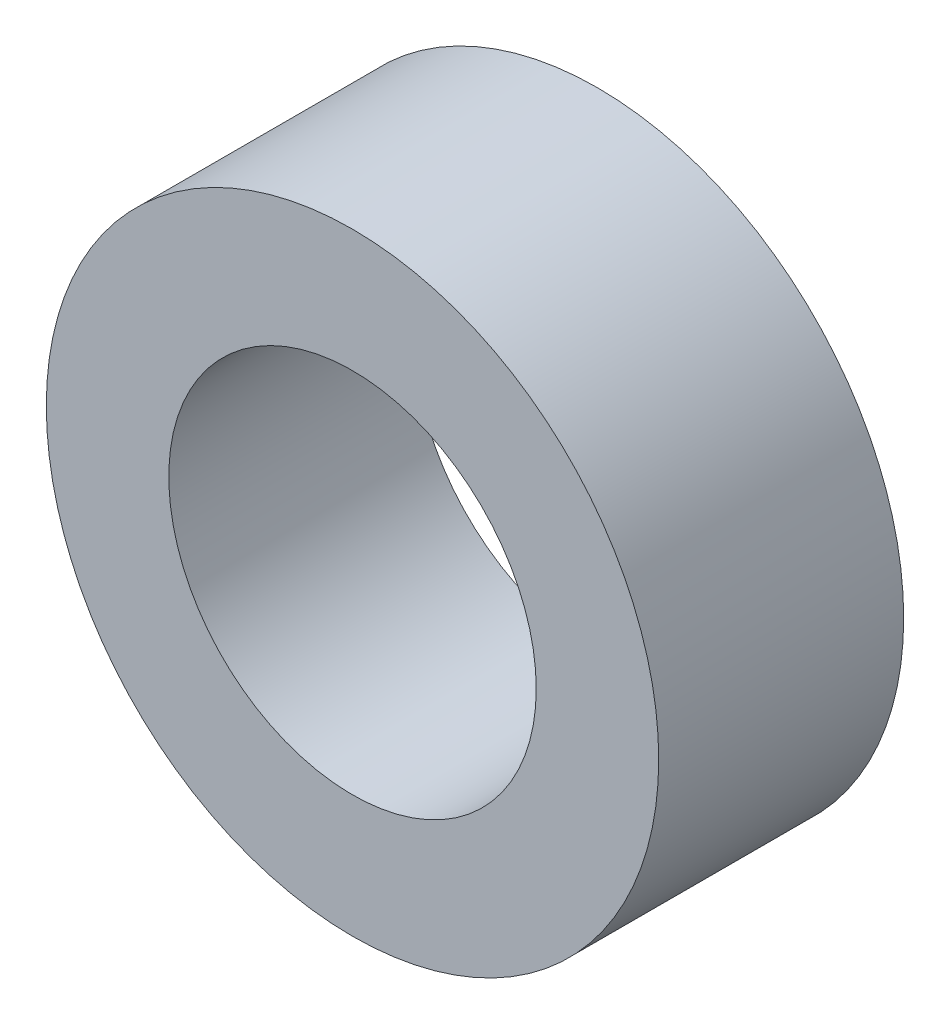
ISO-10303-21;
HEADER;
FILE_DESCRIPTION(('STEP AP214'),'2;1');
FILE_NAME('part.step','',(''),(''),'','','');
FILE_SCHEMA(('AUTOMOTIVE_DESIGN { 1 0 10303 214 1 1 1 1 }'));
ENDSEC;
DATA;
#1=APPLICATION_CONTEXT('core data for automotive mechanical design processes');
#2=APPLICATION_PROTOCOL_DEFINITION('international standard','automotive_design',2000,#1);
#3=PRODUCT_CONTEXT('',#1,'mechanical');
#4=PRODUCT('Part','Part','',(#3));
#5=PRODUCT_RELATED_PRODUCT_CATEGORY('part','',(#4));
#6=PRODUCT_DEFINITION_FORMATION('','',#4);
#7=PRODUCT_DEFINITION_CONTEXT('part definition',#1,'design');
#8=PRODUCT_DEFINITION('design','',#6,#7);
#9=PRODUCT_DEFINITION_SHAPE('','',#8);
#10=(LENGTH_UNIT() NAMED_UNIT(*) SI_UNIT(.MILLI.,.METRE.));
#11=(NAMED_UNIT(*) PLANE_ANGLE_UNIT() SI_UNIT($,.RADIAN.));
#12=(NAMED_UNIT(*) SI_UNIT($,.STERADIAN.) SOLID_ANGLE_UNIT());
#13=UNCERTAINTY_MEASURE_WITH_UNIT(LENGTH_MEASURE(1.E-05),#10,'distance_accuracy_value','');
#14=(GEOMETRIC_REPRESENTATION_CONTEXT(3) GLOBAL_UNCERTAINTY_ASSIGNED_CONTEXT((#13)) GLOBAL_UNIT_ASSIGNED_CONTEXT((#10,
#11,#12)) REPRESENTATION_CONTEXT('',''));
#15=CARTESIAN_POINT('',(0.,0.,0.));
#16=DIRECTION('',(0.,0.,1.));
#17=DIRECTION('',(1.,0.,0.));
#18=AXIS2_PLACEMENT_3D('',#15,#16,#17);
#19=CARTESIAN_POINT('',(0.,0.,6.35));
#20=DIRECTION('',(0.,0.,1.));
#21=DIRECTION('',(1.,0.,0.));
#22=AXIS2_PLACEMENT_3D('',#19,#20,#21);
#23=PLANE('',#22);
#24=CARTESIAN_POINT('',(0.,0.,6.35));
#25=DIRECTION('',(0.,0.,1.));
#26=DIRECTION('',(1.,0.,0.));
#27=AXIS2_PLACEMENT_3D('',#24,#25,#26);
#28=CIRCLE('',#27,7.9375);
#29=CARTESIAN_POINT('',(7.9375,0.,6.35));
#30=VERTEX_POINT('',#29);
#31=EDGE_CURVE('E10',#30,#30,#28,.T.);
#32=ORIENTED_EDGE('',*,*,#31,.T.);
#33=EDGE_LOOP('',(#32));
#34=FACE_BOUND('',#33,.T.);
#35=CARTESIAN_POINT('',(0.,0.,6.35));
#36=DIRECTION('',(0.,0.,1.));
#37=DIRECTION('',(1.,0.,0.));
#38=AXIS2_PLACEMENT_3D('',#35,#36,#37);
#39=CIRCLE('',#38,4.7625);
#40=CARTESIAN_POINT('',(4.7625,0.,6.35));
#41=VERTEX_POINT('',#40);
#42=EDGE_CURVE('E50',#41,#41,#39,.T.);
#43=ORIENTED_EDGE('',*,*,#42,.F.);
#44=EDGE_LOOP('',(#43));
#45=FACE_BOUND('',#44,.T.);
#46=ADVANCED_FACE('F39',(#34,#45),#23,.T.);
#47=CARTESIAN_POINT('',(0.,0.,0.));
#48=DIRECTION('',(0.,0.,1.));
#49=DIRECTION('',(1.,0.,0.));
#50=AXIS2_PLACEMENT_3D('',#47,#48,#49);
#51=PLANE('',#50);
#52=CARTESIAN_POINT('',(0.,0.,0.));
#53=DIRECTION('',(0.,0.,1.));
#54=DIRECTION('',(1.,0.,0.));
#55=AXIS2_PLACEMENT_3D('',#52,#53,#54);
#56=CIRCLE('',#55,7.9375);
#57=CARTESIAN_POINT('',(7.9375,0.,0.));
#58=VERTEX_POINT('',#57);
#59=EDGE_CURVE('E43',#58,#58,#56,.T.);
#60=ORIENTED_EDGE('',*,*,#59,.F.);
#61=EDGE_LOOP('',(#60));
#62=FACE_BOUND('',#61,.T.);
#63=CARTESIAN_POINT('',(0.,0.,0.));
#64=DIRECTION('',(0.,0.,1.));
#65=DIRECTION('',(1.,0.,0.));
#66=AXIS2_PLACEMENT_3D('',#63,#64,#65);
#67=CIRCLE('',#66,4.7625);
#68=CARTESIAN_POINT('',(4.7625,0.,0.));
#69=VERTEX_POINT('',#68);
#70=EDGE_CURVE('E52',#69,#69,#67,.T.);
#71=ORIENTED_EDGE('',*,*,#70,.T.);
#72=EDGE_LOOP('',(#71));
#73=FACE_BOUND('',#72,.T.);
#74=ADVANCED_FACE('F62',(#62,#73),#51,.F.);
#75=CARTESIAN_POINT('',(0.,0.,6.35));
#76=DIRECTION('',(0.,0.,-1.));
#77=DIRECTION('',(-1.,0.,0.));
#78=AXIS2_PLACEMENT_3D('',#75,#76,#77);
#79=CYLINDRICAL_SURFACE('',#78,7.9375);
#80=ORIENTED_EDGE('',*,*,#31,.F.);
#81=EDGE_LOOP('',(#80));
#82=FACE_BOUND('',#81,.T.);
#83=ORIENTED_EDGE('',*,*,#59,.T.);
#84=EDGE_LOOP('',(#83));
#85=FACE_BOUND('',#84,.T.);
#86=ADVANCED_FACE('F41',(#82,#85),#79,.T.);
#87=CARTESIAN_POINT('',(0.,0.,6.35));
#88=DIRECTION('',(0.,0.,-1.));
#89=DIRECTION('',(-1.,0.,0.));
#90=AXIS2_PLACEMENT_3D('',#87,#88,#89);
#91=CYLINDRICAL_SURFACE('',#90,4.7625);
#92=ORIENTED_EDGE('',*,*,#42,.T.);
#93=EDGE_LOOP('',(#92));
#94=FACE_BOUND('',#93,.T.);
#95=ORIENTED_EDGE('',*,*,#70,.F.);
#96=EDGE_LOOP('',(#95));
#97=FACE_BOUND('',#96,.T.);
#98=ADVANCED_FACE('F58',(#94,#97),#91,.F.);
#99=CLOSED_SHELL('',(#46,#74,#86,#98));
#100=MANIFOLD_SOLID_BREP('B2',#99);
#101=ADVANCED_BREP_SHAPE_REPRESENTATION('',(#18,#100),#14);
#102=SHAPE_DEFINITION_REPRESENTATION(#9,#101);
ENDSEC;
END-ISO-10303-21;
